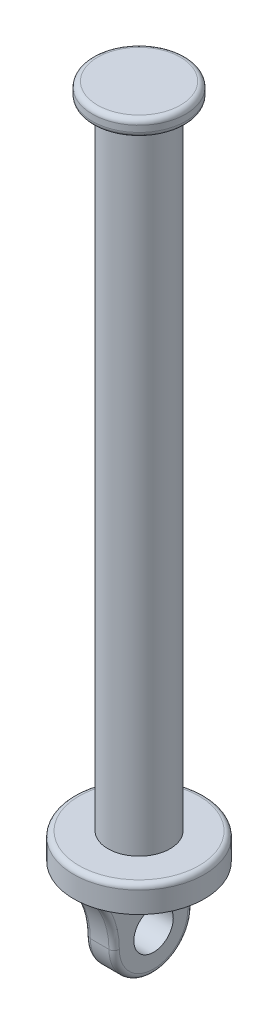
ISO-10303-21;
HEADER;
FILE_DESCRIPTION(('STEP AP214'),'2;1');
FILE_NAME('part.step','',(''),(''),'','','');
FILE_SCHEMA(('AUTOMOTIVE_DESIGN { 1 0 10303 214 1 1 1 1 }'));
ENDSEC;
DATA;
#1=APPLICATION_CONTEXT('core data for automotive mechanical design processes');
#2=APPLICATION_PROTOCOL_DEFINITION('international standard','automotive_design',2000,#1);
#3=PRODUCT_CONTEXT('',#1,'mechanical');
#4=PRODUCT('Part','Part','',(#3));
#5=PRODUCT_RELATED_PRODUCT_CATEGORY('part','',(#4));
#6=PRODUCT_DEFINITION_FORMATION('','',#4);
#7=PRODUCT_DEFINITION_CONTEXT('part definition',#1,'design');
#8=PRODUCT_DEFINITION('design','',#6,#7);
#9=PRODUCT_DEFINITION_SHAPE('','',#8);
#10=(LENGTH_UNIT() NAMED_UNIT(*) SI_UNIT(.MILLI.,.METRE.));
#11=(NAMED_UNIT(*) PLANE_ANGLE_UNIT() SI_UNIT($,.RADIAN.));
#12=(NAMED_UNIT(*) SI_UNIT($,.STERADIAN.) SOLID_ANGLE_UNIT());
#13=UNCERTAINTY_MEASURE_WITH_UNIT(LENGTH_MEASURE(1.E-05),#10,'distance_accuracy_value','');
#14=(GEOMETRIC_REPRESENTATION_CONTEXT(3) GLOBAL_UNCERTAINTY_ASSIGNED_CONTEXT((#13)) GLOBAL_UNIT_ASSIGNED_CONTEXT((#10,
#11,#12)) REPRESENTATION_CONTEXT('',''));
#15=CARTESIAN_POINT('',(0.,0.,0.));
#16=DIRECTION('',(0.,0.,1.));
#17=DIRECTION('',(1.,0.,0.));
#18=AXIS2_PLACEMENT_3D('',#15,#16,#17);
#19=CARTESIAN_POINT('',(0.,-12.7,0.));
#20=DIRECTION('',(0.,-1.,0.));
#21=DIRECTION('',(0.,0.,-1.));
#22=AXIS2_PLACEMENT_3D('',#19,#20,#21);
#23=PLANE('',#22);
#24=CARTESIAN_POINT('',(0.,-12.7,0.));
#25=DIRECTION('',(0.,-1.,0.));
#26=DIRECTION('',(0.,0.,-1.));
#27=AXIS2_PLACEMENT_3D('',#24,#25,#26);
#28=CIRCLE('',#27,31.5);
#29=CARTESIAN_POINT('',(0.,-12.7,-31.5));
#30=VERTEX_POINT('',#29);
#31=EDGE_CURVE('E312',#30,#30,#28,.T.);
#32=ORIENTED_EDGE('',*,*,#31,.T.);
#33=EDGE_LOOP('',(#32));
#34=FACE_BOUND('',#33,.T.);
#35=DIRECTION('',(0.,0.,1.));
#36=VECTOR('',#35,1.);
#37=CARTESIAN_POINT('',(7.,-12.7,28.5));
#38=LINE('',#37,#36);
#39=CARTESIAN_POINT('',(7.,-12.7,-25.2430946320034));
#40=VERTEX_POINT('',#39);
#41=CARTESIAN_POINT('',(7.,-12.7,25.2430946320035));
#42=VERTEX_POINT('',#41);
#43=EDGE_CURVE('E358',#40,#42,#38,.T.);
#44=ORIENTED_EDGE('',*,*,#43,.F.);
#45=CARTESIAN_POINT('',(7.,-12.7,-25.2430946320035));
#46=CARTESIAN_POINT('',(6.99999123906025,-12.7,-25.3486439759068));
#47=CARTESIAN_POINT('',(6.99588962701735,-12.7,-25.4541899029886));
#48=CARTESIAN_POINT('',(6.97953328991133,-12.7,-25.6646864109092));
#49=CARTESIAN_POINT('',(6.9672756133061,-12.7,-25.7696367623478));
#50=CARTESIAN_POINT('',(6.93454299293824,-12.7,-25.9788951030792));
#51=CARTESIAN_POINT('',(6.91401973456081,-12.7,-26.0831955885601));
#52=CARTESIAN_POINT('',(6.86474470719616,-12.7,-26.289796754506));
#53=CARTESIAN_POINT('',(6.83599427367258,-12.7,-26.3920977566572));
#54=CARTESIAN_POINT('',(6.74352718753706,-12.7,-26.6758347230998));
#55=CARTESIAN_POINT('',(6.67034368268867,-12.7,-26.8543053672607));
#56=CARTESIAN_POINT('',(6.49618556838796,-12.7,-27.1968497370266));
#57=CARTESIAN_POINT('',(6.39527518397814,-12.7,-27.3609555920294));
#58=CARTESIAN_POINT('',(6.19254343562665,-12.7,-27.6311139343284));
#59=CARTESIAN_POINT('',(6.09672249515228,-12.7,-27.7416595530389));
#60=CARTESIAN_POINT('',(5.88862722124047,-12.7,-27.9461180144706));
#61=CARTESIAN_POINT('',(5.77637058865681,-12.7,-28.0400485139364));
#62=CARTESIAN_POINT('',(5.55891035456261,-12.7,-28.1904807604052));
#63=CARTESIAN_POINT('',(5.45628319630114,-12.7,-28.2506949690181));
#64=CARTESIAN_POINT('',(5.24257096427967,-12.7,-28.353290750772));
#65=CARTESIAN_POINT('',(5.13150391937339,-12.7,-28.3957091402111));
#66=CARTESIAN_POINT('',(4.93357017321598,-12.7,-28.4514993764686));
#67=CARTESIAN_POINT('',(4.84802259957234,-12.7,-28.4695767060606));
#68=CARTESIAN_POINT('',(4.71834892063807,-12.7,-28.4877717632495));
#69=CARTESIAN_POINT('',(4.67481949174004,-12.7,-28.4923501131843));
#70=CARTESIAN_POINT('',(4.58753075502495,-12.7,-28.4984668140721));
#71=CARTESIAN_POINT('',(4.54377136398393,-12.7,-28.500003975746));
#72=CARTESIAN_POINT('',(4.5,-12.7,-28.5));
#73=B_SPLINE_CURVE_WITH_KNOTS('',3,(#45,#46,#47,#48,#49,#50,#51,#52,#53,#54,#55,#56,#57,#58,#59,
#60,#61,#62,#63,#64,#65,#66,#67,#68,#69,#70,#71,#72),.UNSPECIFIED.,.F.,.F.,(4,2,2,2,2,2,2,2,2,2,
2,2,2,4),(0.,0.31656301881405,0.633240658792555,0.951796874345574,1.27030141005097,
1.84659199003014,2.42155877433154,2.85889109396872,3.29575583509578,3.65130489404936,
4.00611471576225,4.2675948173172,4.39880751960703,4.53007152346516),.UNSPECIFIED.);
#74=CARTESIAN_POINT('',(4.5,-12.7,-28.5));
#75=VERTEX_POINT('',#74);
#76=EDGE_CURVE('E11',#40,#75,#73,.T.);
#77=ORIENTED_EDGE('',*,*,#76,.T.);
#78=DIRECTION('',(-1.,0.,0.));
#79=VECTOR('',#78,1.);
#80=CARTESIAN_POINT('',(7.,-12.7,-28.5));
#81=LINE('',#80,#79);
#82=CARTESIAN_POINT('',(-4.5,-12.7,-28.5));
#83=VERTEX_POINT('',#82);
#84=EDGE_CURVE('E257',#75,#83,#81,.T.);
#85=ORIENTED_EDGE('',*,*,#84,.T.);
#86=CARTESIAN_POINT('',(-4.5,-12.7,-28.5));
#87=CARTESIAN_POINT('',(-4.5582989225471,-12.7,-28.5000186197096));
#88=CARTESIAN_POINT('',(-4.61658787489257,-12.7,-28.4972815871199));
#89=CARTESIAN_POINT('',(-4.73262558582263,-12.7,-28.486439459007));
#90=CARTESIAN_POINT('',(-4.79037468671679,-12.7,-28.4783380375446));
#91=CARTESIAN_POINT('',(-4.90445838222014,-12.7,-28.4569914368231));
#92=CARTESIAN_POINT('',(-4.96080039127309,-12.7,-28.4437858159425));
#93=CARTESIAN_POINT('',(-5.07210028097705,-12.7,-28.4124904414024));
#94=CARTESIAN_POINT('',(-5.12705799015949,-12.7,-28.3944000859082));
#95=CARTESIAN_POINT('',(-5.28902696514693,-12.7,-28.3333491600073));
#96=CARTESIAN_POINT('',(-5.39352308640927,-12.7,-28.2835330256));
#97=CARTESIAN_POINT('',(-5.59369607351267,-12.7,-28.1684536520865));
#98=CARTESIAN_POINT('',(-5.68935448500511,-12.7,-28.1031590617142));
#99=CARTESIAN_POINT('',(-5.90341930900665,-12.7,-27.9342089137873));
#100=CARTESIAN_POINT('',(-6.01761433426957,-12.7,-27.8252062131662));
#101=CARTESIAN_POINT('',(-6.22682307442122,-12.7,-27.5901687896491));
#102=CARTESIAN_POINT('',(-6.32180425437553,-12.7,-27.4641057708021));
#103=CARTESIAN_POINT('',(-6.51710788208498,-12.7,-27.1620373856802));
#104=CARTESIAN_POINT('',(-6.61124274814622,-12.7,-26.9820356731435));
#105=CARTESIAN_POINT('',(-6.76903043270599,-12.7,-26.6091588928456));
#106=CARTESIAN_POINT('',(-6.83265022011471,-12.7,-26.4162701315383));
#107=CARTESIAN_POINT('',(-6.92090362295118,-12.7,-26.0597731048795));
#108=CARTESIAN_POINT('',(-6.95058905437294,-12.7,-25.8973956708807));
#109=CARTESIAN_POINT('',(-6.9802366226064,-12.7,-25.6524799218264));
#110=CARTESIAN_POINT('',(-6.98763900074072,-12.7,-25.5707872735162));
#111=CARTESIAN_POINT('',(-6.99751863217426,-12.7,-25.4071007818966));
#112=CARTESIAN_POINT('',(-6.99999564763601,-12.7,-25.3251069242339));
#113=CARTESIAN_POINT('',(-7.,-12.7,-25.2430946320035));
#114=B_SPLINE_CURVE_WITH_KNOTS('',3,(#86,#87,#88,#89,#90,#91,#92,#93,#94,#95,#96,#97,#98,#99,
#100,#101,#102,#103,#104,#105,#106,#107,#108,#109,#110,#111,#112,#113),.UNSPECIFIED.,.F.,.F.,(4,
2,2,2,2,2,2,2,2,2,2,2,2,4),(0.,0.17481626218431,0.349512916681652,0.522881946888719,
0.696272347169769,1.04187989552567,1.38819353725089,1.85920514400221,2.33100776205857,
2.93722574205024,3.5440984508853,4.03803822046266,4.28398970053323,4.52995305689818),.UNSPECIFIED.);
#115=CARTESIAN_POINT('',(-7.,-12.7,-25.2430946320034));
#116=VERTEX_POINT('',#115);
#117=EDGE_CURVE('E55',#83,#116,#114,.T.);
#118=ORIENTED_EDGE('',*,*,#117,.T.);
#119=DIRECTION('',(0.,0.,1.));
#120=VECTOR('',#119,1.);
#121=CARTESIAN_POINT('',(-7.,-12.7,28.5));
#122=LINE('',#121,#120);
#123=CARTESIAN_POINT('',(-7.,-12.7,25.2430946320035));
#124=VERTEX_POINT('',#123);
#125=EDGE_CURVE('E254',#116,#124,#122,.T.);
#126=ORIENTED_EDGE('',*,*,#125,.T.);
#127=CARTESIAN_POINT('',(-7.,-12.7,25.2430946320035));
#128=CARTESIAN_POINT('',(-6.99999123906025,-12.7,25.3486439759068));
#129=CARTESIAN_POINT('',(-6.99588962701735,-12.7,25.4541899029886));
#130=CARTESIAN_POINT('',(-6.97953328991133,-12.7,25.6646864109092));
#131=CARTESIAN_POINT('',(-6.9672756133061,-12.7,25.7696367623478));
#132=CARTESIAN_POINT('',(-6.93454299293823,-12.7,25.9788951030792));
#133=CARTESIAN_POINT('',(-6.91401973456081,-12.7,26.0831955885601));
#134=CARTESIAN_POINT('',(-6.86474470719616,-12.7,26.289796754506));
#135=CARTESIAN_POINT('',(-6.83599427367257,-12.7,26.3920977566572));
#136=CARTESIAN_POINT('',(-6.74352718753706,-12.7,26.6758347230998));
#137=CARTESIAN_POINT('',(-6.67034368268866,-12.7,26.8543053672607));
#138=CARTESIAN_POINT('',(-6.49618556838796,-12.7,27.1968497370266));
#139=CARTESIAN_POINT('',(-6.39527518397813,-12.7,27.3609555920294));
#140=CARTESIAN_POINT('',(-6.19254343562664,-12.7,27.6311139343284));
#141=CARTESIAN_POINT('',(-6.09672249515227,-12.7,27.7416595530389));
#142=CARTESIAN_POINT('',(-5.88862722124046,-12.7,27.9461180144706));
#143=CARTESIAN_POINT('',(-5.77637058865681,-12.7,28.0400485139364));
#144=CARTESIAN_POINT('',(-5.5589103545626,-12.7,28.1904807604052));
#145=CARTESIAN_POINT('',(-5.45628319630114,-12.7,28.2506949690182));
#146=CARTESIAN_POINT('',(-5.24257096427967,-12.7,28.353290750772));
#147=CARTESIAN_POINT('',(-5.13150391937338,-12.7,28.3957091402111));
#148=CARTESIAN_POINT('',(-4.93357017321598,-12.7,28.4514993764686));
#149=CARTESIAN_POINT('',(-4.84802259957234,-12.7,28.4695767060606));
#150=CARTESIAN_POINT('',(-4.71834892063807,-12.7,28.4877717632495));
#151=CARTESIAN_POINT('',(-4.67481949174004,-12.7,28.4923501131843));
#152=CARTESIAN_POINT('',(-4.58753075502495,-12.7,28.4984668140721));
#153=CARTESIAN_POINT('',(-4.54377136398393,-12.7,28.500003975746));
#154=CARTESIAN_POINT('',(-4.5,-12.7,28.5));
#155=B_SPLINE_CURVE_WITH_KNOTS('',3,(#127,#128,#129,#130,#131,#132,#133,#134,#135,#136,#137,
#138,#139,#140,#141,#142,#143,#144,#145,#146,#147,#148,#149,#150,#151,#152,#153,#154),
.UNSPECIFIED.,.F.,.F.,(4,2,2,2,2,2,2,2,2,2,2,2,2,4),(0.,0.316563018814054,0.633240658792551,
0.95179687434557,1.27030141005097,1.84659199003014,2.42155877433155,2.85889109396872,
3.29575583509578,3.65130489404936,4.00611471576224,4.26759481731719,4.39880751960702,
4.53007152346515),.UNSPECIFIED.);
#156=CARTESIAN_POINT('',(-4.5,-12.7,28.5));
#157=VERTEX_POINT('',#156);
#158=EDGE_CURVE('E192',#124,#157,#155,.T.);
#159=ORIENTED_EDGE('',*,*,#158,.T.);
#160=DIRECTION('',(-1.,0.,0.));
#161=VECTOR('',#160,1.);
#162=CARTESIAN_POINT('',(7.,-12.7,28.5));
#163=LINE('',#162,#161);
#164=CARTESIAN_POINT('',(4.5,-12.7,28.5));
#165=VERTEX_POINT('',#164);
#166=EDGE_CURVE('E137',#165,#157,#163,.T.);
#167=ORIENTED_EDGE('',*,*,#166,.F.);
#168=CARTESIAN_POINT('',(4.5,-12.7,28.5));
#169=CARTESIAN_POINT('',(4.5582989225471,-12.7,28.5000186197096));
#170=CARTESIAN_POINT('',(4.61658787489257,-12.7,28.4972815871199));
#171=CARTESIAN_POINT('',(4.73262558582263,-12.7,28.486439459007));
#172=CARTESIAN_POINT('',(4.79037468671679,-12.7,28.4783380375446));
#173=CARTESIAN_POINT('',(4.90445838222015,-12.7,28.4569914368231));
#174=CARTESIAN_POINT('',(4.96080039127309,-12.7,28.4437858159425));
#175=CARTESIAN_POINT('',(5.07210028097705,-12.7,28.4124904414024));
#176=CARTESIAN_POINT('',(5.1270579901595,-12.7,28.3944000859082));
#177=CARTESIAN_POINT('',(5.28902696514693,-12.7,28.3333491600073));
#178=CARTESIAN_POINT('',(5.39352308640927,-12.7,28.2835330256));
#179=CARTESIAN_POINT('',(5.59369607351267,-12.7,28.1684536520865));
#180=CARTESIAN_POINT('',(5.68935448500511,-12.7,28.1031590617142));
#181=CARTESIAN_POINT('',(5.90341930900665,-12.7,27.9342089137873));
#182=CARTESIAN_POINT('',(6.01761433426957,-12.7,27.8252062131662));
#183=CARTESIAN_POINT('',(6.22682307442122,-12.7,27.5901687896491));
#184=CARTESIAN_POINT('',(6.32180425437553,-12.7,27.4641057708021));
#185=CARTESIAN_POINT('',(6.51710788208498,-12.7,27.1620373856802));
#186=CARTESIAN_POINT('',(6.61124274814623,-12.7,26.9820356731435));
#187=CARTESIAN_POINT('',(6.769030432706,-12.7,26.6091588928456));
#188=CARTESIAN_POINT('',(6.83265022011471,-12.7,26.4162701315383));
#189=CARTESIAN_POINT('',(6.92090362295118,-12.7,26.0597731048795));
#190=CARTESIAN_POINT('',(6.95058905437294,-12.7,25.8973956708807));
#191=CARTESIAN_POINT('',(6.9802366226064,-12.7,25.6524799218264));
#192=CARTESIAN_POINT('',(6.98763900074072,-12.7,25.5707872735162));
#193=CARTESIAN_POINT('',(6.99751863217426,-12.7,25.4071007818966));
#194=CARTESIAN_POINT('',(6.99999564763601,-12.7,25.3251069242339));
#195=CARTESIAN_POINT('',(7.,-12.7,25.2430946320035));
#196=B_SPLINE_CURVE_WITH_KNOTS('',3,(#168,#169,#170,#171,#172,#173,#174,#175,#176,#177,#178,
#179,#180,#181,#182,#183,#184,#185,#186,#187,#188,#189,#190,#191,#192,#193,#194,#195),
.UNSPECIFIED.,.F.,.F.,(4,2,2,2,2,2,2,2,2,2,2,2,2,4),(0.,0.17481626218431,0.349512916681652,
0.52288194688872,0.696272347169769,1.04187989552568,1.38819353725089,1.85920514400221,
2.33100776205857,2.93722574205024,3.5440984508853,4.03803822046265,4.28398970053322,
4.52995305689818),.UNSPECIFIED.);
#197=EDGE_CURVE('E145',#165,#42,#196,.T.);
#198=ORIENTED_EDGE('',*,*,#197,.T.);
#199=EDGE_LOOP('',(#44,#77,#85,#118,#126,#159,#167,#198));
#200=FACE_BOUND('',#199,.T.);
#201=ADVANCED_FACE('F45',(#34,#200),#23,.T.);
#202=CARTESIAN_POINT('',(0.,305.,0.));
#203=DIRECTION('',(0.,-1.,0.));
#204=DIRECTION('',(0.,0.,-1.));
#205=AXIS2_PLACEMENT_3D('',#202,#203,#204);
#206=CYLINDRICAL_SURFACE('',#205,15.);
#207=CARTESIAN_POINT('',(0.,305.,0.));
#208=DIRECTION('',(0.,1.,0.));
#209=DIRECTION('',(0.,0.,1.));
#210=AXIS2_PLACEMENT_3D('',#207,#208,#209);
#211=CIRCLE('',#210,15.);
#212=CARTESIAN_POINT('',(0.,305.,15.));
#213=VERTEX_POINT('',#212);
#214=EDGE_CURVE('E147',#213,#213,#211,.T.);
#215=ORIENTED_EDGE('',*,*,#214,.F.);
#216=EDGE_LOOP('',(#215));
#217=FACE_BOUND('',#216,.T.);
#218=CARTESIAN_POINT('',(0.,0.,0.));
#219=DIRECTION('',(0.,1.,0.));
#220=DIRECTION('',(0.,0.,1.));
#221=AXIS2_PLACEMENT_3D('',#218,#219,#220);
#222=CIRCLE('',#221,15.);
#223=CARTESIAN_POINT('',(0.,0.,15.));
#224=VERTEX_POINT('',#223);
#225=EDGE_CURVE('E314',#224,#224,#222,.T.);
#226=ORIENTED_EDGE('',*,*,#225,.T.);
#227=EDGE_LOOP('',(#226));
#228=FACE_BOUND('',#227,.T.);
#229=ADVANCED_FACE('F183',(#217,#228),#206,.T.);
#230=CARTESIAN_POINT('',(0.,313.,0.));
#231=DIRECTION('',(0.,-1.,0.));
#232=DIRECTION('',(0.,0.,-1.));
#233=AXIS2_PLACEMENT_3D('',#230,#231,#232);
#234=CYLINDRICAL_SURFACE('',#233,22.5);
#235=CARTESIAN_POINT('',(0.,310.5,0.));
#236=DIRECTION('',(0.,1.,0.));
#237=DIRECTION('',(0.,0.,1.));
#238=AXIS2_PLACEMENT_3D('',#235,#236,#237);
#239=CIRCLE('',#238,22.5);
#240=CARTESIAN_POINT('',(0.,310.5,22.5));
#241=VERTEX_POINT('',#240);
#242=EDGE_CURVE('E228',#241,#241,#239,.F.);
#243=ORIENTED_EDGE('',*,*,#242,.T.);
#244=EDGE_LOOP('',(#243));
#245=FACE_BOUND('',#244,.T.);
#246=CARTESIAN_POINT('',(0.,307.5,0.));
#247=DIRECTION('',(0.,1.,0.));
#248=DIRECTION('',(0.,0.,1.));
#249=AXIS2_PLACEMENT_3D('',#246,#247,#248);
#250=CIRCLE('',#249,22.5);
#251=CARTESIAN_POINT('',(0.,307.5,22.5));
#252=VERTEX_POINT('',#251);
#253=EDGE_CURVE('E235',#252,#252,#250,.T.);
#254=ORIENTED_EDGE('',*,*,#253,.T.);
#255=EDGE_LOOP('',(#254));
#256=FACE_BOUND('',#255,.T.);
#257=ADVANCED_FACE('F289',(#245,#256),#234,.T.);
#258=CARTESIAN_POINT('',(0.,313.,0.));
#259=DIRECTION('',(0.,1.,0.));
#260=DIRECTION('',(0.,0.,1.));
#261=AXIS2_PLACEMENT_3D('',#258,#259,#260);
#262=PLANE('',#261);
#263=CARTESIAN_POINT('',(0.,313.,0.));
#264=DIRECTION('',(0.,1.,0.));
#265=DIRECTION('',(0.,0.,1.));
#266=AXIS2_PLACEMENT_3D('',#263,#264,#265);
#267=CIRCLE('',#266,20.);
#268=CARTESIAN_POINT('',(0.,313.,20.));
#269=VERTEX_POINT('',#268);
#270=EDGE_CURVE('E282',#269,#269,#267,.T.);
#271=ORIENTED_EDGE('',*,*,#270,.T.);
#272=EDGE_LOOP('',(#271));
#273=FACE_BOUND('',#272,.T.);
#274=ADVANCED_FACE('F395',(#273),#262,.T.);
#275=CARTESIAN_POINT('',(0.,305.,0.));
#276=DIRECTION('',(0.,1.,0.));
#277=DIRECTION('',(0.,0.,1.));
#278=AXIS2_PLACEMENT_3D('',#275,#276,#277);
#279=PLANE('',#278);
#280=CARTESIAN_POINT('',(0.,305.,0.));
#281=DIRECTION('',(0.,1.,0.));
#282=DIRECTION('',(0.,0.,1.));
#283=AXIS2_PLACEMENT_3D('',#280,#281,#282);
#284=CIRCLE('',#283,20.);
#285=CARTESIAN_POINT('',(0.,305.,20.));
#286=VERTEX_POINT('',#285);
#287=EDGE_CURVE('E245',#286,#286,#284,.F.);
#288=ORIENTED_EDGE('',*,*,#287,.T.);
#289=EDGE_LOOP('',(#288));
#290=FACE_BOUND('',#289,.T.);
#291=ORIENTED_EDGE('',*,*,#214,.T.);
#292=EDGE_LOOP('',(#291));
#293=FACE_BOUND('',#292,.T.);
#294=ADVANCED_FACE('F309',(#290,#293),#279,.F.);
#295=CARTESIAN_POINT('',(0.,-12.7,0.));
#296=DIRECTION('',(0.,1.,0.));
#297=DIRECTION('',(0.,0.,1.));
#298=AXIS2_PLACEMENT_3D('',#295,#296,#297);
#299=CYLINDRICAL_SURFACE('',#298,31.5);
#300=CARTESIAN_POINT('',(0.,-2.5,0.));
#301=DIRECTION('',(0.,-1.,0.));
#302=DIRECTION('',(0.,0.,-1.));
#303=AXIS2_PLACEMENT_3D('',#300,#301,#302);
#304=CIRCLE('',#303,31.5);
#305=CARTESIAN_POINT('',(0.,-2.5,-31.5));
#306=VERTEX_POINT('',#305);
#307=EDGE_CURVE('E232',#306,#306,#304,.T.);
#308=ORIENTED_EDGE('',*,*,#307,.T.);
#309=EDGE_LOOP('',(#308));
#310=FACE_BOUND('',#309,.T.);
#311=ORIENTED_EDGE('',*,*,#31,.F.);
#312=EDGE_LOOP('',(#311));
#313=FACE_BOUND('',#312,.T.);
#314=ADVANCED_FACE('F306',(#310,#313),#299,.T.);
#315=CARTESIAN_POINT('',(0.,0.,0.));
#316=DIRECTION('',(0.,-1.,0.));
#317=DIRECTION('',(0.,0.,-1.));
#318=AXIS2_PLACEMENT_3D('',#315,#316,#317);
#319=PLANE('',#318);
#320=CARTESIAN_POINT('',(0.,0.,0.));
#321=DIRECTION('',(0.,-1.,0.));
#322=DIRECTION('',(0.,0.,-1.));
#323=AXIS2_PLACEMENT_3D('',#320,#321,#322);
#324=CIRCLE('',#323,29.);
#325=CARTESIAN_POINT('',(0.,0.,-29.));
#326=VERTEX_POINT('',#325);
#327=EDGE_CURVE('E242',#326,#326,#324,.F.);
#328=ORIENTED_EDGE('',*,*,#327,.T.);
#329=EDGE_LOOP('',(#328));
#330=FACE_BOUND('',#329,.T.);
#331=ORIENTED_EDGE('',*,*,#225,.F.);
#332=EDGE_LOOP('',(#331));
#333=FACE_BOUND('',#332,.T.);
#334=ADVANCED_FACE('F187',(#330,#333),#319,.F.);
#335=CARTESIAN_POINT('',(7.,-37.834818240167,-56.99984056155));
#336=DIRECTION('',(-1.,0.,0.));
#337=DIRECTION('',(0.,0.,1.));
#338=AXIS2_PLACEMENT_3D('',#335,#336,#337);
#339=PLANE('',#338);
#340=ORIENTED_EDGE('',*,*,#43,.T.);
#341=CARTESIAN_POINT('',(7.,-37.834818240167,56.99984056155));
#342=DIRECTION('',(-1.,0.,0.));
#343=DIRECTION('',(0.,0.,1.));
#344=AXIS2_PLACEMENT_3D('',#341,#342,#343);
#345=CIRCLE('',#344,40.5);
#346=CARTESIAN_POINT('',(7.,-37.7390263326799,16.4999538467645));
#347=VERTEX_POINT('',#346);
#348=EDGE_CURVE('E279',#42,#347,#345,.T.);
#349=ORIENTED_EDGE('',*,*,#348,.T.);
#350=CARTESIAN_POINT('',(7.,-37.7,0.));
#351=DIRECTION('',(-1.,0.,0.));
#352=DIRECTION('',(0.,0.,1.));
#353=AXIS2_PLACEMENT_3D('',#350,#351,#352);
#354=CIRCLE('',#353,16.5);
#355=CARTESIAN_POINT('',(7.,-37.7390263326799,-16.4999538467645));
#356=VERTEX_POINT('',#355);
#357=EDGE_CURVE('E150',#347,#356,#354,.F.);
#358=ORIENTED_EDGE('',*,*,#357,.T.);
#359=CARTESIAN_POINT('',(7.,-37.834818240167,-56.99984056155));
#360=DIRECTION('',(-1.,0.,0.));
#361=DIRECTION('',(0.,0.,1.));
#362=AXIS2_PLACEMENT_3D('',#359,#360,#361);
#363=CIRCLE('',#362,40.5);
#364=EDGE_CURVE('E225',#356,#40,#363,.T.);
#365=ORIENTED_EDGE('',*,*,#364,.T.);
#366=EDGE_LOOP('',(#340,#349,#358,#365));
#367=FACE_BOUND('',#366,.T.);
#368=CARTESIAN_POINT('',(7.,-37.7,0.));
#369=DIRECTION('',(1.,0.,0.));
#370=DIRECTION('',(0.,0.,-1.));
#371=AXIS2_PLACEMENT_3D('',#368,#369,#370);
#372=CIRCLE('',#371,9.5);
#373=CARTESIAN_POINT('',(7.,-37.7,-9.50000000000001));
#374=VERTEX_POINT('',#373);
#375=EDGE_CURVE('E368',#374,#374,#372,.T.);
#376=ORIENTED_EDGE('',*,*,#375,.F.);
#377=EDGE_LOOP('',(#376));
#378=FACE_BOUND('',#377,.T.);
#379=ADVANCED_FACE('F332',(#367,#378),#339,.F.);
#380=CARTESIAN_POINT('',(-7.,-37.834818240167,-56.99984056155));
#381=DIRECTION('',(-1.,0.,0.));
#382=DIRECTION('',(0.,0.,1.));
#383=AXIS2_PLACEMENT_3D('',#380,#381,#382);
#384=PLANE('',#383);
#385=CARTESIAN_POINT('',(-7.,-37.7,0.));
#386=DIRECTION('',(-1.,0.,0.));
#387=DIRECTION('',(0.,0.,1.));
#388=AXIS2_PLACEMENT_3D('',#385,#386,#387);
#389=CIRCLE('',#388,16.5);
#390=CARTESIAN_POINT('',(-7.,-37.7390263326799,-16.4999538467645));
#391=VERTEX_POINT('',#390);
#392=CARTESIAN_POINT('',(-7.,-37.7390263326799,16.4999538467645));
#393=VERTEX_POINT('',#392);
#394=EDGE_CURVE('E265',#391,#393,#389,.T.);
#395=ORIENTED_EDGE('',*,*,#394,.T.);
#396=CARTESIAN_POINT('',(-7.,-37.834818240167,56.99984056155));
#397=DIRECTION('',(-1.,0.,0.));
#398=DIRECTION('',(0.,0.,1.));
#399=AXIS2_PLACEMENT_3D('',#396,#397,#398);
#400=CIRCLE('',#399,40.5);
#401=EDGE_CURVE('E125',#393,#124,#400,.F.);
#402=ORIENTED_EDGE('',*,*,#401,.T.);
#403=ORIENTED_EDGE('',*,*,#125,.F.);
#404=CARTESIAN_POINT('',(-7.,-37.834818240167,-56.99984056155));
#405=DIRECTION('',(-1.,0.,0.));
#406=DIRECTION('',(0.,0.,1.));
#407=AXIS2_PLACEMENT_3D('',#404,#405,#406);
#408=CIRCLE('',#407,40.5);
#409=EDGE_CURVE('E262',#116,#391,#408,.F.);
#410=ORIENTED_EDGE('',*,*,#409,.T.);
#411=EDGE_LOOP('',(#395,#402,#403,#410));
#412=FACE_BOUND('',#411,.T.);
#413=CARTESIAN_POINT('',(-7.,-37.7,0.));
#414=DIRECTION('',(1.,0.,0.));
#415=DIRECTION('',(0.,0.,-1.));
#416=AXIS2_PLACEMENT_3D('',#413,#414,#415);
#417=CIRCLE('',#416,9.5);
#418=CARTESIAN_POINT('',(-7.,-37.7,-9.50000000000001));
#419=VERTEX_POINT('',#418);
#420=EDGE_CURVE('E160',#419,#419,#417,.T.);
#421=ORIENTED_EDGE('',*,*,#420,.T.);
#422=EDGE_LOOP('',(#421));
#423=FACE_BOUND('',#422,.T.);
#424=ADVANCED_FACE('F337',(#412,#423),#384,.T.);
#425=CARTESIAN_POINT('',(7.,-37.834818240167,-56.99984056155));
#426=DIRECTION('',(-1.,0.,0.));
#427=DIRECTION('',(0.,0.,1.));
#428=AXIS2_PLACEMENT_3D('',#425,#426,#427);
#429=CYLINDRICAL_SURFACE('',#428,38.);
#430=DIRECTION('',(-1.,0.,0.));
#431=VECTOR('',#430,1.);
#432=CARTESIAN_POINT('',(7.,-37.744939413389,-18.99994685385));
#433=LINE('',#432,#431);
#434=CARTESIAN_POINT('',(4.5,-37.744939413389,-18.99994685385));
#435=VERTEX_POINT('',#434);
#436=CARTESIAN_POINT('',(-4.5,-37.744939413389,-18.99994685385));
#437=VERTEX_POINT('',#436);
#438=EDGE_CURVE('E118',#435,#437,#433,.T.);
#439=ORIENTED_EDGE('',*,*,#438,.T.);
#440=CARTESIAN_POINT('',(-4.5,-37.834818240167,-56.99984056155));
#441=DIRECTION('',(-1.,0.,0.));
#442=DIRECTION('',(0.,0.,1.));
#443=AXIS2_PLACEMENT_3D('',#440,#441,#442);
#444=CIRCLE('',#443,38.);
#445=EDGE_CURVE('E63',#437,#83,#444,.T.);
#446=ORIENTED_EDGE('',*,*,#445,.T.);
#447=ORIENTED_EDGE('',*,*,#84,.F.);
#448=CARTESIAN_POINT('',(4.5,-37.834818240167,-56.99984056155));
#449=DIRECTION('',(-1.,0.,0.));
#450=DIRECTION('',(0.,0.,1.));
#451=AXIS2_PLACEMENT_3D('',#448,#449,#450);
#452=CIRCLE('',#451,38.);
#453=EDGE_CURVE('E226',#75,#435,#452,.F.);
#454=ORIENTED_EDGE('',*,*,#453,.T.);
#455=EDGE_LOOP('',(#439,#446,#447,#454));
#456=FACE_BOUND('',#455,.T.);
#457=ADVANCED_FACE('F185',(#456),#429,.F.);
#458=CARTESIAN_POINT('',(7.,-37.834818240167,56.99984056155));
#459=DIRECTION('',(-1.,0.,0.));
#460=DIRECTION('',(0.,0.,1.));
#461=AXIS2_PLACEMENT_3D('',#458,#459,#460);
#462=CYLINDRICAL_SURFACE('',#461,38.);
#463=ORIENTED_EDGE('',*,*,#166,.T.);
#464=CARTESIAN_POINT('',(-4.5,-37.834818240167,56.99984056155));
#465=DIRECTION('',(-1.,0.,0.));
#466=DIRECTION('',(0.,0.,1.));
#467=AXIS2_PLACEMENT_3D('',#464,#465,#466);
#468=CIRCLE('',#467,38.);
#469=CARTESIAN_POINT('',(-4.5,-37.744939413389,18.99994685385));
#470=VERTEX_POINT('',#469);
#471=EDGE_CURVE('E135',#157,#470,#468,.T.);
#472=ORIENTED_EDGE('',*,*,#471,.T.);
#473=DIRECTION('',(-1.,0.,0.));
#474=VECTOR('',#473,1.);
#475=CARTESIAN_POINT('',(7.,-37.744939413389,18.99994685385));
#476=LINE('',#475,#474);
#477=CARTESIAN_POINT('',(4.5,-37.744939413389,18.99994685385));
#478=VERTEX_POINT('',#477);
#479=EDGE_CURVE('E117',#478,#470,#476,.T.);
#480=ORIENTED_EDGE('',*,*,#479,.F.);
#481=CARTESIAN_POINT('',(4.5,-37.834818240167,56.99984056155));
#482=DIRECTION('',(-1.,0.,0.));
#483=DIRECTION('',(0.,0.,1.));
#484=AXIS2_PLACEMENT_3D('',#481,#482,#483);
#485=CIRCLE('',#484,38.);
#486=EDGE_CURVE('E132',#478,#165,#485,.F.);
#487=ORIENTED_EDGE('',*,*,#486,.T.);
#488=EDGE_LOOP('',(#463,#472,#480,#487));
#489=FACE_BOUND('',#488,.T.);
#490=ADVANCED_FACE('F131',(#489),#462,.F.);
#491=CARTESIAN_POINT('',(7.,-37.7,0.));
#492=DIRECTION('',(-1.,0.,0.));
#493=DIRECTION('',(0.,0.,1.));
#494=AXIS2_PLACEMENT_3D('',#491,#492,#493);
#495=CYLINDRICAL_SURFACE('',#494,19.);
#496=ORIENTED_EDGE('',*,*,#479,.T.);
#497=CARTESIAN_POINT('',(-4.5,-37.7,0.));
#498=DIRECTION('',(-1.,0.,0.));
#499=DIRECTION('',(0.,0.,1.));
#500=AXIS2_PLACEMENT_3D('',#497,#498,#499);
#501=CIRCLE('',#500,19.);
#502=EDGE_CURVE('E124',#470,#437,#501,.F.);
#503=ORIENTED_EDGE('',*,*,#502,.T.);
#504=ORIENTED_EDGE('',*,*,#438,.F.);
#505=CARTESIAN_POINT('',(4.5,-37.7,0.));
#506=DIRECTION('',(-1.,0.,0.));
#507=DIRECTION('',(0.,0.,1.));
#508=AXIS2_PLACEMENT_3D('',#505,#506,#507);
#509=CIRCLE('',#508,19.);
#510=EDGE_CURVE('E114',#435,#478,#509,.T.);
#511=ORIENTED_EDGE('',*,*,#510,.T.);
#512=EDGE_LOOP('',(#496,#503,#504,#511));
#513=FACE_BOUND('',#512,.T.);
#514=ADVANCED_FACE('F116',(#513),#495,.T.);
#515=CARTESIAN_POINT('',(7.,-37.7,0.));
#516=DIRECTION('',(-1.,0.,0.));
#517=DIRECTION('',(0.,0.,1.));
#518=AXIS2_PLACEMENT_3D('',#515,#516,#517);
#519=CYLINDRICAL_SURFACE('',#518,9.5);
#520=ORIENTED_EDGE('',*,*,#375,.T.);
#521=EDGE_LOOP('',(#520));
#522=FACE_BOUND('',#521,.T.);
#523=ORIENTED_EDGE('',*,*,#420,.F.);
#524=EDGE_LOOP('',(#523));
#525=FACE_BOUND('',#524,.T.);
#526=ADVANCED_FACE('F348',(#522,#525),#519,.F.);
#527=CARTESIAN_POINT('',(-4.5,-37.834818240167,-56.99984056155));
#528=DIRECTION('',(-1.,0.,0.));
#529=DIRECTION('',(0.,0.,1.));
#530=AXIS2_PLACEMENT_3D('',#527,#528,#529);
#531=TOROIDAL_SURFACE('',#530,40.5,2.5);
#532=ORIENTED_EDGE('',*,*,#117,.F.);
#533=ORIENTED_EDGE('',*,*,#445,.F.);
#534=CARTESIAN_POINT('',(-4.5,-37.7390263326799,-16.4999538467645));
#535=DIRECTION('',(0.,-0.99999720283421,0.00236523228363262));
#536=DIRECTION('',(0.,-0.00236523228363262,-0.99999720283421));
#537=AXIS2_PLACEMENT_3D('',#534,#535,#536);
#538=CIRCLE('',#537,2.5);
#539=EDGE_CURVE('E156',#391,#437,#538,.T.);
#540=ORIENTED_EDGE('',*,*,#539,.F.);
#541=ORIENTED_EDGE('',*,*,#409,.F.);
#542=EDGE_LOOP('',(#532,#533,#540,#541));
#543=FACE_BOUND('',#542,.T.);
#544=ADVANCED_FACE('F209',(#543),#531,.T.);
#545=CARTESIAN_POINT('',(-4.5,-37.7,0.));
#546=DIRECTION('',(-1.,0.,0.));
#547=DIRECTION('',(0.,0.,1.));
#548=AXIS2_PLACEMENT_3D('',#545,#546,#547);
#549=TOROIDAL_SURFACE('',#548,16.5,2.5);
#550=ORIENTED_EDGE('',*,*,#539,.T.);
#551=ORIENTED_EDGE('',*,*,#502,.F.);
#552=CARTESIAN_POINT('',(-4.5,-37.7390263326799,16.4999538467645));
#553=DIRECTION('',(0.,0.99999720283421,0.00236523228363262));
#554=DIRECTION('',(0.,-0.00236523228363262,0.99999720283421));
#555=AXIS2_PLACEMENT_3D('',#552,#553,#554);
#556=CIRCLE('',#555,2.5);
#557=EDGE_CURVE('E154',#393,#470,#556,.T.);
#558=ORIENTED_EDGE('',*,*,#557,.F.);
#559=ORIENTED_EDGE('',*,*,#394,.F.);
#560=EDGE_LOOP('',(#550,#551,#558,#559));
#561=FACE_BOUND('',#560,.T.);
#562=ADVANCED_FACE('F221',(#561),#549,.T.);
#563=CARTESIAN_POINT('',(-4.5,-37.834818240167,56.99984056155));
#564=DIRECTION('',(-1.,0.,0.));
#565=DIRECTION('',(0.,0.,1.));
#566=AXIS2_PLACEMENT_3D('',#563,#564,#565);
#567=TOROIDAL_SURFACE('',#566,40.5,2.5);
#568=ORIENTED_EDGE('',*,*,#158,.F.);
#569=ORIENTED_EDGE('',*,*,#401,.F.);
#570=ORIENTED_EDGE('',*,*,#557,.T.);
#571=ORIENTED_EDGE('',*,*,#471,.F.);
#572=EDGE_LOOP('',(#568,#569,#570,#571));
#573=FACE_BOUND('',#572,.T.);
#574=ADVANCED_FACE('F216',(#573),#567,.T.);
#575=CARTESIAN_POINT('',(4.5,-37.834818240167,-56.99984056155));
#576=DIRECTION('',(-1.,0.,0.));
#577=DIRECTION('',(0.,0.,1.));
#578=AXIS2_PLACEMENT_3D('',#575,#576,#577);
#579=TOROIDAL_SURFACE('',#578,40.5,2.5);
#580=ORIENTED_EDGE('',*,*,#76,.F.);
#581=ORIENTED_EDGE('',*,*,#364,.F.);
#582=CARTESIAN_POINT('',(4.5,-37.7390263326799,-16.4999538467645));
#583=DIRECTION('',(0.,-0.99999720283421,0.00236523228362984));
#584=DIRECTION('',(0.,-0.00236523228362984,-0.99999720283421));
#585=AXIS2_PLACEMENT_3D('',#582,#583,#584);
#586=CIRCLE('',#585,2.5);
#587=EDGE_CURVE('E49',#435,#356,#586,.T.);
#588=ORIENTED_EDGE('',*,*,#587,.F.);
#589=ORIENTED_EDGE('',*,*,#453,.F.);
#590=EDGE_LOOP('',(#580,#581,#588,#589));
#591=FACE_BOUND('',#590,.T.);
#592=ADVANCED_FACE('F175',(#591),#579,.T.);
#593=CARTESIAN_POINT('',(4.5,-37.7,0.));
#594=DIRECTION('',(-1.,0.,0.));
#595=DIRECTION('',(0.,0.,1.));
#596=AXIS2_PLACEMENT_3D('',#593,#594,#595);
#597=TOROIDAL_SURFACE('',#596,16.5,2.5);
#598=ORIENTED_EDGE('',*,*,#587,.T.);
#599=ORIENTED_EDGE('',*,*,#357,.F.);
#600=CARTESIAN_POINT('',(4.5,-37.7390263326799,16.4999538467645));
#601=DIRECTION('',(0.,0.99999720283421,0.00236523228362984));
#602=DIRECTION('',(0.,-0.00236523228362984,0.99999720283421));
#603=AXIS2_PLACEMENT_3D('',#600,#601,#602);
#604=CIRCLE('',#603,2.5);
#605=EDGE_CURVE('E143',#478,#347,#604,.T.);
#606=ORIENTED_EDGE('',*,*,#605,.F.);
#607=ORIENTED_EDGE('',*,*,#510,.F.);
#608=EDGE_LOOP('',(#598,#599,#606,#607));
#609=FACE_BOUND('',#608,.T.);
#610=ADVANCED_FACE('F149',(#609),#597,.T.);
#611=CARTESIAN_POINT('',(4.5,-37.834818240167,56.99984056155));
#612=DIRECTION('',(-1.,0.,0.));
#613=DIRECTION('',(0.,0.,1.));
#614=AXIS2_PLACEMENT_3D('',#611,#612,#613);
#615=TOROIDAL_SURFACE('',#614,40.5,2.5);
#616=ORIENTED_EDGE('',*,*,#197,.F.);
#617=ORIENTED_EDGE('',*,*,#486,.F.);
#618=ORIENTED_EDGE('',*,*,#605,.T.);
#619=ORIENTED_EDGE('',*,*,#348,.F.);
#620=EDGE_LOOP('',(#616,#617,#618,#619));
#621=FACE_BOUND('',#620,.T.);
#622=ADVANCED_FACE('F141',(#621),#615,.T.);
#623=CARTESIAN_POINT('',(0.,310.5,0.));
#624=DIRECTION('',(0.,1.,0.));
#625=DIRECTION('',(0.,0.,1.));
#626=AXIS2_PLACEMENT_3D('',#623,#624,#625);
#627=TOROIDAL_SURFACE('',#626,20.,2.5);
#628=ORIENTED_EDGE('',*,*,#242,.F.);
#629=EDGE_LOOP('',(#628));
#630=FACE_BOUND('',#629,.T.);
#631=ORIENTED_EDGE('',*,*,#270,.F.);
#632=EDGE_LOOP('',(#631));
#633=FACE_BOUND('',#632,.T.);
#634=ADVANCED_FACE('F208',(#630,#633),#627,.T.);
#635=CARTESIAN_POINT('',(0.,-2.5,0.));
#636=DIRECTION('',(0.,-1.,0.));
#637=DIRECTION('',(0.,0.,-1.));
#638=AXIS2_PLACEMENT_3D('',#635,#636,#637);
#639=TOROIDAL_SURFACE('',#638,29.,2.5);
#640=ORIENTED_EDGE('',*,*,#327,.F.);
#641=EDGE_LOOP('',(#640));
#642=FACE_BOUND('',#641,.T.);
#643=ORIENTED_EDGE('',*,*,#307,.F.);
#644=EDGE_LOOP('',(#643));
#645=FACE_BOUND('',#644,.T.);
#646=ADVANCED_FACE('F292',(#642,#645),#639,.T.);
#647=CARTESIAN_POINT('',(0.,307.5,0.));
#648=DIRECTION('',(0.,1.,0.));
#649=DIRECTION('',(0.,0.,1.));
#650=AXIS2_PLACEMENT_3D('',#647,#648,#649);
#651=TOROIDAL_SURFACE('',#650,20.,2.5);
#652=ORIENTED_EDGE('',*,*,#287,.F.);
#653=EDGE_LOOP('',(#652));
#654=FACE_BOUND('',#653,.T.);
#655=ORIENTED_EDGE('',*,*,#253,.F.);
#656=EDGE_LOOP('',(#655));
#657=FACE_BOUND('',#656,.T.);
#658=ADVANCED_FACE('F47',(#654,#657),#651,.T.);
#659=CLOSED_SHELL('',(#201,#229,#257,#274,#294,#314,#334,#379,#424,#457,#490,#514,#526,#544,
#562,#574,#592,#610,#622,#634,#646,#658));
#660=MANIFOLD_SOLID_BREP('B2',#659);
#661=ADVANCED_BREP_SHAPE_REPRESENTATION('',(#18,#660),#14);
#662=SHAPE_DEFINITION_REPRESENTATION(#9,#661);
ENDSEC;
END-ISO-10303-21;
